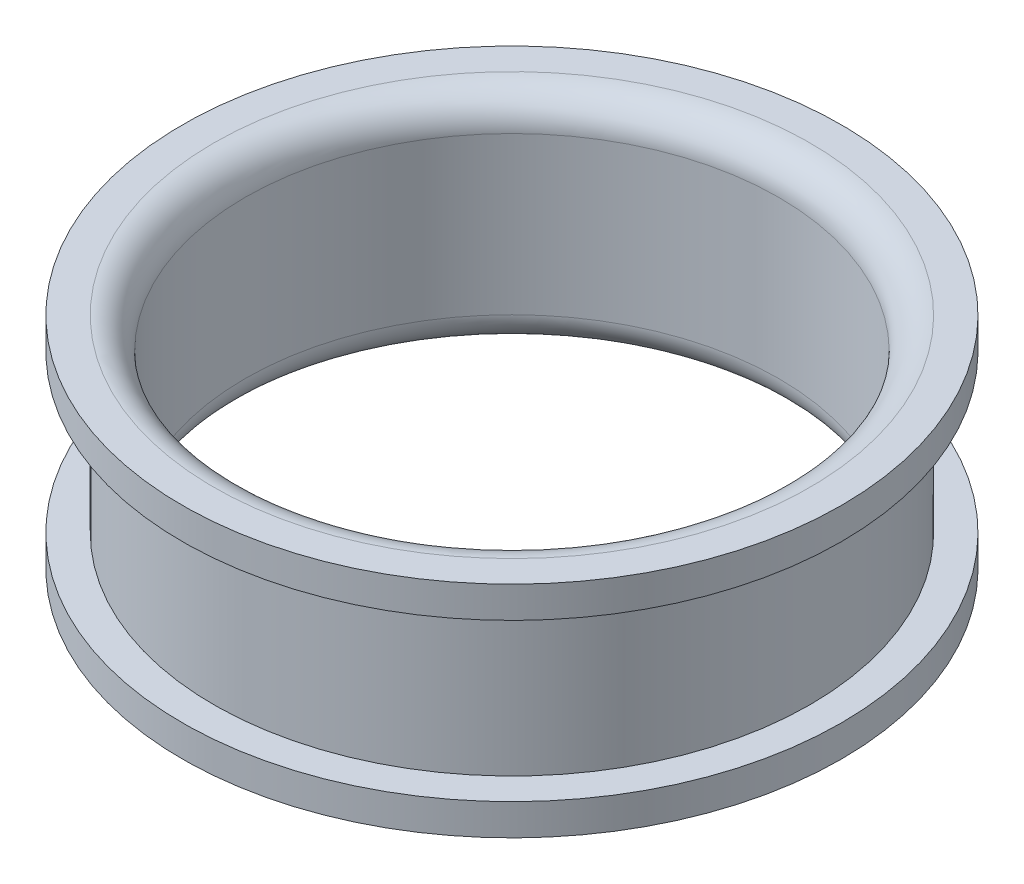
ISO-10303-21;
HEADER;
FILE_DESCRIPTION(('STEP AP214'),'2;1');
FILE_NAME('part.step','',(''),(''),'','','');
FILE_SCHEMA(('AUTOMOTIVE_DESIGN { 1 0 10303 214 1 1 1 1 }'));
ENDSEC;
DATA;
#1=APPLICATION_CONTEXT('core data for automotive mechanical design processes');
#2=APPLICATION_PROTOCOL_DEFINITION('international standard','automotive_design',2000,#1);
#3=PRODUCT_CONTEXT('',#1,'mechanical');
#4=PRODUCT('Part','Part','',(#3));
#5=PRODUCT_RELATED_PRODUCT_CATEGORY('part','',(#4));
#6=PRODUCT_DEFINITION_FORMATION('','',#4);
#7=PRODUCT_DEFINITION_CONTEXT('part definition',#1,'design');
#8=PRODUCT_DEFINITION('design','',#6,#7);
#9=PRODUCT_DEFINITION_SHAPE('','',#8);
#10=(LENGTH_UNIT() NAMED_UNIT(*) SI_UNIT(.MILLI.,.METRE.));
#11=(NAMED_UNIT(*) PLANE_ANGLE_UNIT() SI_UNIT($,.RADIAN.));
#12=(NAMED_UNIT(*) SI_UNIT($,.STERADIAN.) SOLID_ANGLE_UNIT());
#13=UNCERTAINTY_MEASURE_WITH_UNIT(LENGTH_MEASURE(1.E-05),#10,'distance_accuracy_value','');
#14=(GEOMETRIC_REPRESENTATION_CONTEXT(3) GLOBAL_UNCERTAINTY_ASSIGNED_CONTEXT((#13)) GLOBAL_UNIT_ASSIGNED_CONTEXT((#10,
#11,#12)) REPRESENTATION_CONTEXT('',''));
#15=CARTESIAN_POINT('',(0.,0.,0.));
#16=DIRECTION('',(0.,0.,1.));
#17=DIRECTION('',(1.,0.,0.));
#18=AXIS2_PLACEMENT_3D('',#15,#16,#17);
#19=CARTESIAN_POINT('',(3.49696643932152E-12,-1019.44973687258,0.));
#20=DIRECTION('',(0.,-1.,0.));
#21=DIRECTION('',(1.,0.,0.));
#22=AXIS2_PLACEMENT_3D('',#19,#20,#21);
#23=CYLINDRICAL_SURFACE('',#22,42.5);
#24=CARTESIAN_POINT('',(0.,12.4999999999997,0.));
#25=DIRECTION('',(0.,1.,0.));
#26=DIRECTION('',(-1.,0.,0.));
#27=AXIS2_PLACEMENT_3D('',#24,#25,#26);
#28=CIRCLE('',#27,42.5);
#29=CARTESIAN_POINT('',(-42.5,12.4999999999996,0.));
#30=VERTEX_POINT('',#29);
#31=EDGE_CURVE('E38',#30,#30,#28,.T.);
#32=ORIENTED_EDGE('',*,*,#31,.T.);
#33=EDGE_LOOP('',(#32));
#34=FACE_BOUND('',#33,.T.);
#35=CARTESIAN_POINT('',(0.,-12.5000000000002,0.));
#36=DIRECTION('',(0.,-1.,0.));
#37=DIRECTION('',(1.,0.,0.));
#38=AXIS2_PLACEMENT_3D('',#35,#36,#37);
#39=CIRCLE('',#38,42.5);
#40=CARTESIAN_POINT('',(42.5,-12.5,0.));
#41=VERTEX_POINT('',#40);
#42=EDGE_CURVE('E42',#41,#41,#39,.T.);
#43=ORIENTED_EDGE('',*,*,#42,.T.);
#44=EDGE_LOOP('',(#43));
#45=FACE_BOUND('',#44,.T.);
#46=ADVANCED_FACE('F31',(#34,#45),#23,.F.);
#47=CARTESIAN_POINT('',(42.5,-17.5,0.));
#48=DIRECTION('',(0.,-1.,0.));
#49=DIRECTION('',(1.,0.,0.));
#50=AXIS2_PLACEMENT_3D('',#47,#48,#49);
#51=PLANE('',#50);
#52=CARTESIAN_POINT('',(0.,-17.5000000000002,0.));
#53=DIRECTION('',(0.,-1.,0.));
#54=DIRECTION('',(1.,0.,0.));
#55=AXIS2_PLACEMENT_3D('',#52,#53,#54);
#56=CIRCLE('',#55,47.5);
#57=CARTESIAN_POINT('',(47.5000000000001,-17.5,0.));
#58=VERTEX_POINT('',#57);
#59=EDGE_CURVE('E10',#58,#58,#56,.F.);
#60=ORIENTED_EDGE('',*,*,#59,.T.);
#61=EDGE_LOOP('',(#60));
#62=FACE_BOUND('',#61,.T.);
#63=CARTESIAN_POINT('',(0.,-17.5000000000003,0.));
#64=DIRECTION('',(0.,-1.,0.));
#65=DIRECTION('',(1.,0.,0.));
#66=AXIS2_PLACEMENT_3D('',#63,#64,#65);
#67=CIRCLE('',#66,52.4999999999999);
#68=CARTESIAN_POINT('',(52.5,-17.5000000000001,0.));
#69=VERTEX_POINT('',#68);
#70=EDGE_CURVE('E51',#69,#69,#67,.T.);
#71=ORIENTED_EDGE('',*,*,#70,.T.);
#72=EDGE_LOOP('',(#71));
#73=FACE_BOUND('',#72,.T.);
#74=ADVANCED_FACE('F86',(#62,#73),#51,.T.);
#75=CARTESIAN_POINT('',(3.49696643932152E-12,-1019.44973687258,0.));
#76=DIRECTION('',(0.,-1.,0.));
#77=DIRECTION('',(1.,0.,0.));
#78=AXIS2_PLACEMENT_3D('',#75,#76,#77);
#79=CYLINDRICAL_SURFACE('',#78,52.5);
#80=CARTESIAN_POINT('',(0.,-12.5000000000002,0.));
#81=DIRECTION('',(0.,-1.,0.));
#82=DIRECTION('',(1.,0.,0.));
#83=AXIS2_PLACEMENT_3D('',#80,#81,#82);
#84=CIRCLE('',#83,52.5);
#85=CARTESIAN_POINT('',(52.5,-12.5,0.));
#86=VERTEX_POINT('',#85);
#87=EDGE_CURVE('E54',#86,#86,#84,.T.);
#88=ORIENTED_EDGE('',*,*,#87,.T.);
#89=EDGE_LOOP('',(#88));
#90=FACE_BOUND('',#89,.T.);
#91=ORIENTED_EDGE('',*,*,#70,.F.);
#92=EDGE_LOOP('',(#91));
#93=FACE_BOUND('',#92,.T.);
#94=ADVANCED_FACE('F91',(#90,#93),#79,.T.);
#95=CARTESIAN_POINT('',(52.5,-12.5,0.));
#96=DIRECTION('',(0.,1.,0.));
#97=DIRECTION('',(-1.,0.,0.));
#98=AXIS2_PLACEMENT_3D('',#95,#96,#97);
#99=PLANE('',#98);
#100=CARTESIAN_POINT('',(0.,-12.5000000000002,0.));
#101=DIRECTION('',(0.,-1.,0.));
#102=DIRECTION('',(1.,0.,0.));
#103=AXIS2_PLACEMENT_3D('',#100,#101,#102);
#104=CIRCLE('',#103,47.5);
#105=CARTESIAN_POINT('',(47.5,-12.5,0.));
#106=VERTEX_POINT('',#105);
#107=EDGE_CURVE('E57',#106,#106,#104,.T.);
#108=ORIENTED_EDGE('',*,*,#107,.T.);
#109=EDGE_LOOP('',(#108));
#110=FACE_BOUND('',#109,.T.);
#111=ORIENTED_EDGE('',*,*,#87,.F.);
#112=EDGE_LOOP('',(#111));
#113=FACE_BOUND('',#112,.T.);
#114=ADVANCED_FACE('F97',(#110,#113),#99,.T.);
#115=CARTESIAN_POINT('',(3.49696643932152E-12,-1019.44973687258,0.));
#116=DIRECTION('',(0.,-1.,0.));
#117=DIRECTION('',(1.,0.,0.));
#118=AXIS2_PLACEMENT_3D('',#115,#116,#117);
#119=CYLINDRICAL_SURFACE('',#118,47.5);
#120=CARTESIAN_POINT('',(0.,12.4999999999997,0.));
#121=DIRECTION('',(0.,-1.,0.));
#122=DIRECTION('',(1.,0.,0.));
#123=AXIS2_PLACEMENT_3D('',#120,#121,#122);
#124=CIRCLE('',#123,47.5);
#125=CARTESIAN_POINT('',(47.5,12.4999999999999,0.));
#126=VERTEX_POINT('',#125);
#127=EDGE_CURVE('E60',#126,#126,#124,.T.);
#128=ORIENTED_EDGE('',*,*,#127,.T.);
#129=EDGE_LOOP('',(#128));
#130=FACE_BOUND('',#129,.T.);
#131=ORIENTED_EDGE('',*,*,#107,.F.);
#132=EDGE_LOOP('',(#131));
#133=FACE_BOUND('',#132,.T.);
#134=ADVANCED_FACE('F101',(#130,#133),#119,.T.);
#135=CARTESIAN_POINT('',(47.5,12.5,0.));
#136=DIRECTION('',(0.,-1.,0.));
#137=DIRECTION('',(1.,0.,0.));
#138=AXIS2_PLACEMENT_3D('',#135,#136,#137);
#139=PLANE('',#138);
#140=CARTESIAN_POINT('',(0.,12.4999999999997,0.));
#141=DIRECTION('',(0.,-1.,0.));
#142=DIRECTION('',(1.,0.,0.));
#143=AXIS2_PLACEMENT_3D('',#140,#141,#142);
#144=CIRCLE('',#143,52.5);
#145=CARTESIAN_POINT('',(52.5,12.4999999999999,0.));
#146=VERTEX_POINT('',#145);
#147=EDGE_CURVE('E63',#146,#146,#144,.T.);
#148=ORIENTED_EDGE('',*,*,#147,.T.);
#149=EDGE_LOOP('',(#148));
#150=FACE_BOUND('',#149,.T.);
#151=ORIENTED_EDGE('',*,*,#127,.F.);
#152=EDGE_LOOP('',(#151));
#153=FACE_BOUND('',#152,.T.);
#154=ADVANCED_FACE('F83',(#150,#153),#139,.T.);
#155=CARTESIAN_POINT('',(3.49696643932152E-12,-1019.44973687258,0.));
#156=DIRECTION('',(0.,-1.,0.));
#157=DIRECTION('',(1.,0.,0.));
#158=AXIS2_PLACEMENT_3D('',#155,#156,#157);
#159=CYLINDRICAL_SURFACE('',#158,52.5);
#160=CARTESIAN_POINT('',(0.,17.4999999999999,0.));
#161=DIRECTION('',(0.,-1.,0.));
#162=DIRECTION('',(1.,0.,0.));
#163=AXIS2_PLACEMENT_3D('',#160,#161,#162);
#164=CIRCLE('',#163,52.5000000000001);
#165=CARTESIAN_POINT('',(52.5,17.5,0.));
#166=VERTEX_POINT('',#165);
#167=EDGE_CURVE('E66',#166,#166,#164,.T.);
#168=ORIENTED_EDGE('',*,*,#167,.T.);
#169=EDGE_LOOP('',(#168));
#170=FACE_BOUND('',#169,.T.);
#171=ORIENTED_EDGE('',*,*,#147,.F.);
#172=EDGE_LOOP('',(#171));
#173=FACE_BOUND('',#172,.T.);
#174=ADVANCED_FACE('F70',(#170,#173),#159,.T.);
#175=CARTESIAN_POINT('',(52.5,17.5,0.));
#176=DIRECTION('',(0.,1.,0.));
#177=DIRECTION('',(-1.,0.,0.));
#178=AXIS2_PLACEMENT_3D('',#175,#176,#177);
#179=PLANE('',#178);
#180=CARTESIAN_POINT('',(0.,17.4999999999998,0.));
#181=DIRECTION('',(0.,1.,0.));
#182=DIRECTION('',(-1.,0.,0.));
#183=AXIS2_PLACEMENT_3D('',#180,#181,#182);
#184=CIRCLE('',#183,47.5);
#185=CARTESIAN_POINT('',(-47.5000000000001,17.4999999999997,0.));
#186=VERTEX_POINT('',#185);
#187=EDGE_CURVE('E46',#186,#186,#184,.F.);
#188=ORIENTED_EDGE('',*,*,#187,.T.);
#189=EDGE_LOOP('',(#188));
#190=FACE_BOUND('',#189,.T.);
#191=ORIENTED_EDGE('',*,*,#167,.F.);
#192=EDGE_LOOP('',(#191));
#193=FACE_BOUND('',#192,.T.);
#194=ADVANCED_FACE('F73',(#190,#193),#179,.T.);
#195=CARTESIAN_POINT('',(0.,12.4999999999997,0.));
#196=DIRECTION('',(0.,1.,0.));
#197=DIRECTION('',(-1.,0.,0.));
#198=AXIS2_PLACEMENT_3D('',#195,#196,#197);
#199=TOROIDAL_SURFACE('',#198,47.5,5.);
#200=ORIENTED_EDGE('',*,*,#31,.F.);
#201=EDGE_LOOP('',(#200));
#202=FACE_BOUND('',#201,.T.);
#203=ORIENTED_EDGE('',*,*,#187,.F.);
#204=EDGE_LOOP('',(#203));
#205=FACE_BOUND('',#204,.T.);
#206=ADVANCED_FACE('F75',(#202,#205),#199,.T.);
#207=CARTESIAN_POINT('',(0.,-12.5000000000002,0.));
#208=DIRECTION('',(0.,-1.,0.));
#209=DIRECTION('',(1.,0.,0.));
#210=AXIS2_PLACEMENT_3D('',#207,#208,#209);
#211=TOROIDAL_SURFACE('',#210,47.5,5.);
#212=ORIENTED_EDGE('',*,*,#59,.F.);
#213=EDGE_LOOP('',(#212));
#214=FACE_BOUND('',#213,.T.);
#215=ORIENTED_EDGE('',*,*,#42,.F.);
#216=EDGE_LOOP('',(#215));
#217=FACE_BOUND('',#216,.T.);
#218=ADVANCED_FACE('F33',(#214,#217),#211,.T.);
#219=CLOSED_SHELL('',(#46,#74,#94,#114,#134,#154,#174,#194,#206,#218));
#220=MANIFOLD_SOLID_BREP('B2',#219);
#221=ADVANCED_BREP_SHAPE_REPRESENTATION('',(#18,#220),#14);
#222=SHAPE_DEFINITION_REPRESENTATION(#9,#221);
ENDSEC;
END-ISO-10303-21;
